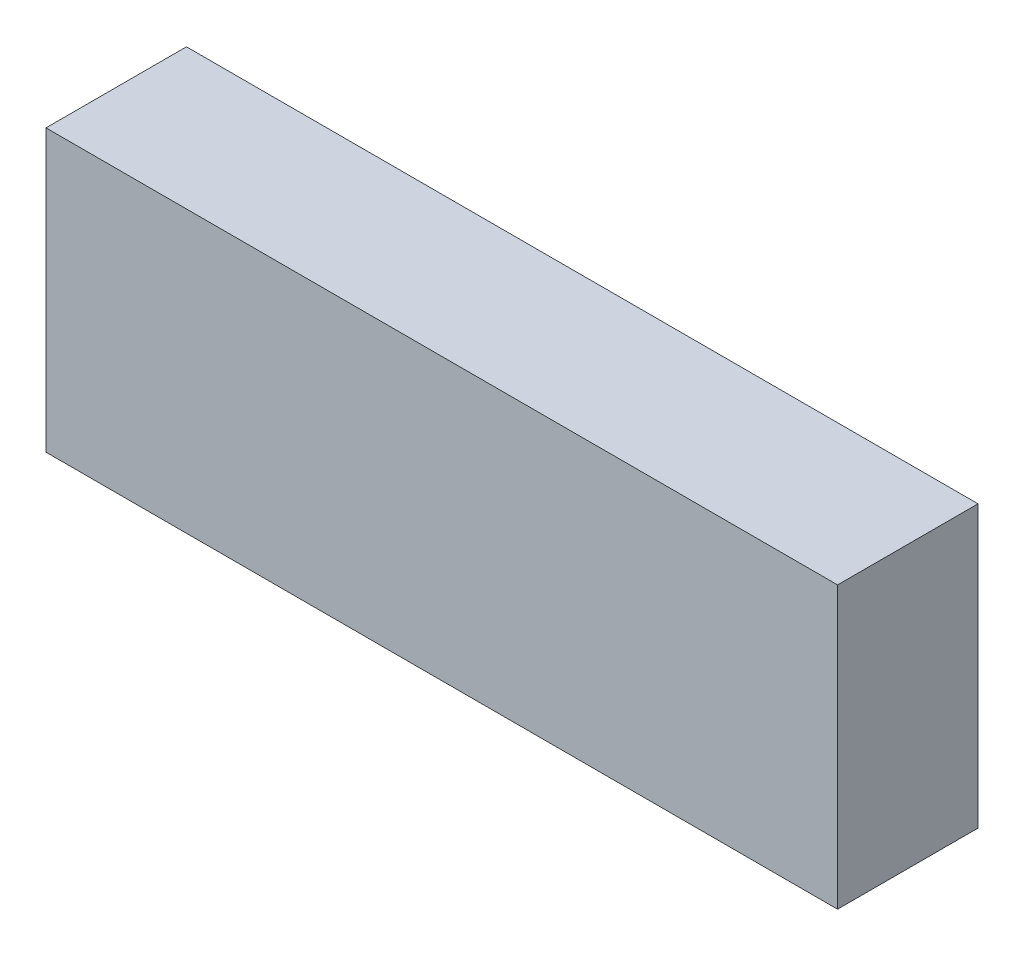
ISO-10303-21;
HEADER;
FILE_DESCRIPTION(('STEP AP214'),'2;1');
FILE_NAME('part.step','',(''),(''),'','','');
FILE_SCHEMA(('AUTOMOTIVE_DESIGN { 1 0 10303 214 1 1 1 1 }'));
ENDSEC;
DATA;
#1=APPLICATION_CONTEXT('core data for automotive mechanical design processes');
#2=APPLICATION_PROTOCOL_DEFINITION('international standard','automotive_design',2000,#1);
#3=PRODUCT_CONTEXT('',#1,'mechanical');
#4=PRODUCT('Part','Part','',(#3));
#5=PRODUCT_RELATED_PRODUCT_CATEGORY('part','',(#4));
#6=PRODUCT_DEFINITION_FORMATION('','',#4);
#7=PRODUCT_DEFINITION_CONTEXT('part definition',#1,'design');
#8=PRODUCT_DEFINITION('design','',#6,#7);
#9=PRODUCT_DEFINITION_SHAPE('','',#8);
#10=(LENGTH_UNIT() NAMED_UNIT(*) SI_UNIT(.MILLI.,.METRE.));
#11=(NAMED_UNIT(*) PLANE_ANGLE_UNIT() SI_UNIT($,.RADIAN.));
#12=(NAMED_UNIT(*) SI_UNIT($,.STERADIAN.) SOLID_ANGLE_UNIT());
#13=UNCERTAINTY_MEASURE_WITH_UNIT(LENGTH_MEASURE(1.E-05),#10,'distance_accuracy_value','');
#14=(GEOMETRIC_REPRESENTATION_CONTEXT(3) GLOBAL_UNCERTAINTY_ASSIGNED_CONTEXT((#13)) GLOBAL_UNIT_ASSIGNED_CONTEXT((#10,
#11,#12)) REPRESENTATION_CONTEXT('',''));
#15=CARTESIAN_POINT('',(0.,0.,0.));
#16=DIRECTION('',(0.,0.,1.));
#17=DIRECTION('',(1.,0.,0.));
#18=AXIS2_PLACEMENT_3D('',#15,#16,#17);
#19=CARTESIAN_POINT('',(6.57317073170732,-7.04268292682927,5.5));
#20=DIRECTION('',(-1.,0.,0.));
#21=DIRECTION('',(0.,0.,1.));
#22=AXIS2_PLACEMENT_3D('',#19,#20,#21);
#23=PLANE('',#22);
#24=DIRECTION('',(0.,1.,0.));
#25=VECTOR('',#24,1.);
#26=CARTESIAN_POINT('',(6.57317073170732,-7.04268292682927,0.));
#27=LINE('',#26,#25);
#28=CARTESIAN_POINT('',(6.57317073170732,-7.04268292682927,0.));
#29=VERTEX_POINT('',#28);
#30=CARTESIAN_POINT('',(6.57317073170732,3.95731707317073,0.));
#31=VERTEX_POINT('',#30);
#32=EDGE_CURVE('E102',#29,#31,#27,.T.);
#33=ORIENTED_EDGE('',*,*,#32,.T.);
#34=DIRECTION('',(0.,0.,-1.));
#35=VECTOR('',#34,1.);
#36=CARTESIAN_POINT('',(6.57317073170732,3.95731707317073,5.5));
#37=LINE('',#36,#35);
#38=CARTESIAN_POINT('',(6.57317073170732,3.95731707317073,5.5));
#39=VERTEX_POINT('',#38);
#40=EDGE_CURVE('E11',#39,#31,#37,.T.);
#41=ORIENTED_EDGE('',*,*,#40,.F.);
#42=DIRECTION('',(0.,1.,0.));
#43=VECTOR('',#42,1.);
#44=CARTESIAN_POINT('',(6.57317073170732,-7.04268292682927,5.5));
#45=LINE('',#44,#43);
#46=CARTESIAN_POINT('',(6.57317073170732,-7.04268292682927,5.5));
#47=VERTEX_POINT('',#46);
#48=EDGE_CURVE('E90',#47,#39,#45,.T.);
#49=ORIENTED_EDGE('',*,*,#48,.F.);
#50=DIRECTION('',(0.,0.,-1.));
#51=VECTOR('',#50,1.);
#52=CARTESIAN_POINT('',(6.57317073170732,-7.04268292682927,5.5));
#53=LINE('',#52,#51);
#54=EDGE_CURVE('E98',#47,#29,#53,.T.);
#55=ORIENTED_EDGE('',*,*,#54,.T.);
#56=EDGE_LOOP('',(#33,#41,#49,#55));
#57=FACE_BOUND('',#56,.T.);
#58=ADVANCED_FACE('F39',(#57),#23,.F.);
#59=CARTESIAN_POINT('',(6.57317073170732,3.95731707317073,5.5));
#60=DIRECTION('',(0.,-1.,0.));
#61=DIRECTION('',(1.,0.,0.));
#62=AXIS2_PLACEMENT_3D('',#59,#60,#61);
#63=PLANE('',#62);
#64=DIRECTION('',(-1.,0.,0.));
#65=VECTOR('',#64,1.);
#66=CARTESIAN_POINT('',(6.57317073170732,3.95731707317073,0.));
#67=LINE('',#66,#65);
#68=CARTESIAN_POINT('',(-24.4268292682927,3.95731707317073,0.));
#69=VERTEX_POINT('',#68);
#70=EDGE_CURVE('E94',#31,#69,#67,.T.);
#71=ORIENTED_EDGE('',*,*,#70,.T.);
#72=DIRECTION('',(0.,0.,-1.));
#73=VECTOR('',#72,1.);
#74=CARTESIAN_POINT('',(-24.4268292682927,3.95731707317073,5.5));
#75=LINE('',#74,#73);
#76=CARTESIAN_POINT('',(-24.4268292682927,3.95731707317073,5.5));
#77=VERTEX_POINT('',#76);
#78=EDGE_CURVE('E47',#77,#69,#75,.T.);
#79=ORIENTED_EDGE('',*,*,#78,.F.);
#80=DIRECTION('',(-1.,0.,0.));
#81=VECTOR('',#80,1.);
#82=CARTESIAN_POINT('',(6.57317073170732,3.95731707317073,5.5));
#83=LINE('',#82,#81);
#84=EDGE_CURVE('E85',#39,#77,#83,.T.);
#85=ORIENTED_EDGE('',*,*,#84,.F.);
#86=ORIENTED_EDGE('',*,*,#40,.T.);
#87=EDGE_LOOP('',(#71,#79,#85,#86));
#88=FACE_BOUND('',#87,.T.);
#89=ADVANCED_FACE('F93',(#88),#63,.F.);
#90=CARTESIAN_POINT('',(-24.4268292682927,-7.04268292682927,5.5));
#91=DIRECTION('',(1.,0.,0.));
#92=DIRECTION('',(0.,0.,-1.));
#93=AXIS2_PLACEMENT_3D('',#90,#91,#92);
#94=PLANE('',#93);
#95=DIRECTION('',(0.,-1.,0.));
#96=VECTOR('',#95,1.);
#97=CARTESIAN_POINT('',(-24.4268292682927,-7.04268292682927,0.));
#98=LINE('',#97,#96);
#99=CARTESIAN_POINT('',(-24.4268292682927,-7.04268292682927,0.));
#100=VERTEX_POINT('',#99);
#101=EDGE_CURVE('E72',#69,#100,#98,.T.);
#102=ORIENTED_EDGE('',*,*,#101,.T.);
#103=DIRECTION('',(0.,0.,-1.));
#104=VECTOR('',#103,1.);
#105=CARTESIAN_POINT('',(-24.4268292682927,-7.04268292682927,5.5));
#106=LINE('',#105,#104);
#107=CARTESIAN_POINT('',(-24.4268292682927,-7.04268292682927,5.5));
#108=VERTEX_POINT('',#107);
#109=EDGE_CURVE('E95',#108,#100,#106,.T.);
#110=ORIENTED_EDGE('',*,*,#109,.F.);
#111=DIRECTION('',(0.,-1.,0.));
#112=VECTOR('',#111,1.);
#113=CARTESIAN_POINT('',(-24.4268292682927,-7.04268292682927,5.5));
#114=LINE('',#113,#112);
#115=EDGE_CURVE('E88',#77,#108,#114,.T.);
#116=ORIENTED_EDGE('',*,*,#115,.F.);
#117=ORIENTED_EDGE('',*,*,#78,.T.);
#118=EDGE_LOOP('',(#102,#110,#116,#117));
#119=FACE_BOUND('',#118,.T.);
#120=ADVANCED_FACE('F96',(#119),#94,.F.);
#121=CARTESIAN_POINT('',(6.57317073170732,-7.04268292682927,5.5));
#122=DIRECTION('',(0.,1.,0.));
#123=DIRECTION('',(-1.,0.,0.));
#124=AXIS2_PLACEMENT_3D('',#121,#122,#123);
#125=PLANE('',#124);
#126=DIRECTION('',(1.,0.,0.));
#127=VECTOR('',#126,1.);
#128=CARTESIAN_POINT('',(6.57317073170732,-7.04268292682927,0.));
#129=LINE('',#128,#127);
#130=EDGE_CURVE('E78',#100,#29,#129,.T.);
#131=ORIENTED_EDGE('',*,*,#130,.T.);
#132=ORIENTED_EDGE('',*,*,#54,.F.);
#133=DIRECTION('',(1.,0.,0.));
#134=VECTOR('',#133,1.);
#135=CARTESIAN_POINT('',(6.57317073170732,-7.04268292682927,5.5));
#136=LINE('',#135,#134);
#137=EDGE_CURVE('E55',#108,#47,#136,.T.);
#138=ORIENTED_EDGE('',*,*,#137,.F.);
#139=ORIENTED_EDGE('',*,*,#109,.T.);
#140=EDGE_LOOP('',(#131,#132,#138,#139));
#141=FACE_BOUND('',#140,.T.);
#142=ADVANCED_FACE('F109',(#141),#125,.F.);
#143=CARTESIAN_POINT('',(0.,0.,5.5));
#144=DIRECTION('',(0.,0.,1.));
#145=DIRECTION('',(1.,0.,0.));
#146=AXIS2_PLACEMENT_3D('',#143,#144,#145);
#147=PLANE('',#146);
#148=ORIENTED_EDGE('',*,*,#48,.T.);
#149=ORIENTED_EDGE('',*,*,#84,.T.);
#150=ORIENTED_EDGE('',*,*,#115,.T.);
#151=ORIENTED_EDGE('',*,*,#137,.T.);
#152=EDGE_LOOP('',(#148,#149,#150,#151));
#153=FACE_BOUND('',#152,.T.);
#154=ADVANCED_FACE('F86',(#153),#147,.T.);
#155=CARTESIAN_POINT('',(0.,0.,0.));
#156=DIRECTION('',(0.,0.,1.));
#157=DIRECTION('',(1.,0.,0.));
#158=AXIS2_PLACEMENT_3D('',#155,#156,#157);
#159=PLANE('',#158);
#160=ORIENTED_EDGE('',*,*,#32,.F.);
#161=ORIENTED_EDGE('',*,*,#130,.F.);
#162=ORIENTED_EDGE('',*,*,#101,.F.);
#163=ORIENTED_EDGE('',*,*,#70,.F.);
#164=EDGE_LOOP('',(#160,#161,#162,#163));
#165=FACE_BOUND('',#164,.T.);
#166=ADVANCED_FACE('F112',(#165),#159,.F.);
#167=CLOSED_SHELL('',(#58,#89,#120,#142,#154,#166));
#168=MANIFOLD_SOLID_BREP('B2',#167);
#169=ADVANCED_BREP_SHAPE_REPRESENTATION('',(#18,#168),#14);
#170=SHAPE_DEFINITION_REPRESENTATION(#9,#169);
ENDSEC;
END-ISO-10303-21;
